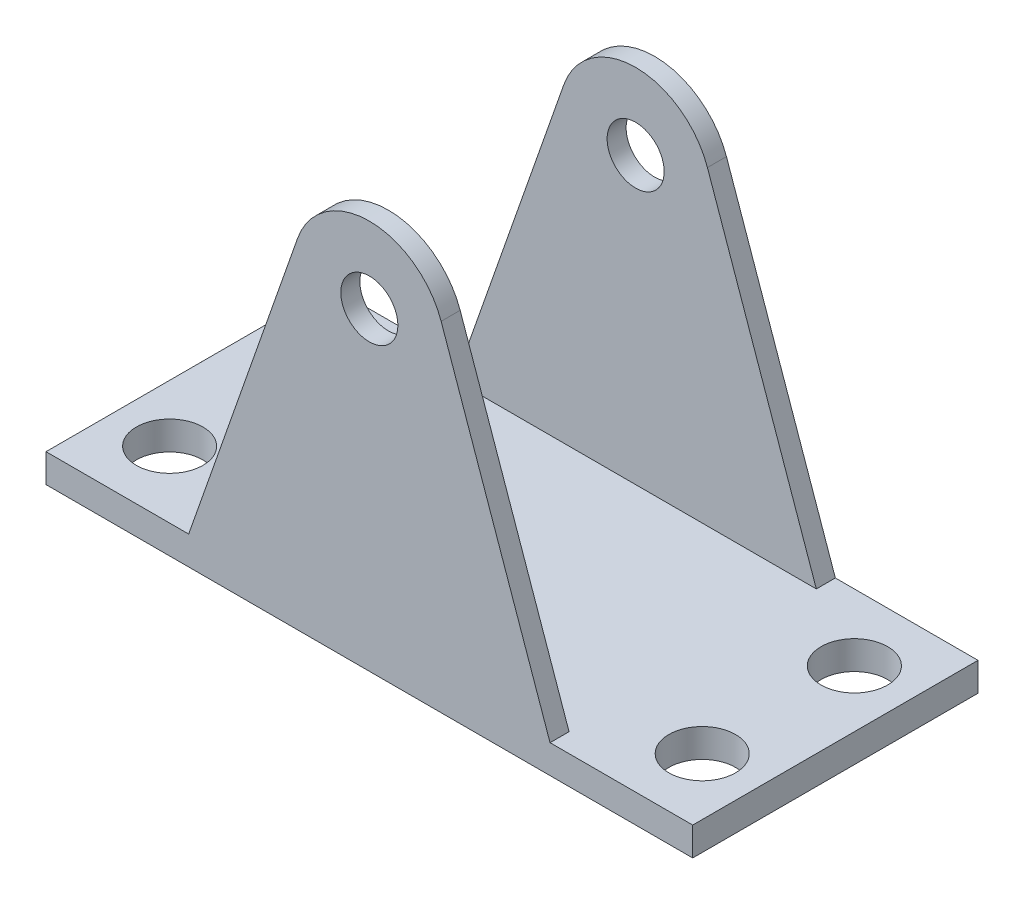
ISO-10303-21;
HEADER;
FILE_DESCRIPTION(('STEP AP214'),'2;1');
FILE_NAME('part.step','',(''),(''),'','','');
FILE_SCHEMA(('AUTOMOTIVE_DESIGN { 1 0 10303 214 1 1 1 1 }'));
ENDSEC;
DATA;
#1=APPLICATION_CONTEXT('core data for automotive mechanical design processes');
#2=APPLICATION_PROTOCOL_DEFINITION('international standard','automotive_design',2000,#1);
#3=PRODUCT_CONTEXT('',#1,'mechanical');
#4=PRODUCT('Part','Part','',(#3));
#5=PRODUCT_RELATED_PRODUCT_CATEGORY('part','',(#4));
#6=PRODUCT_DEFINITION_FORMATION('','',#4);
#7=PRODUCT_DEFINITION_CONTEXT('part definition',#1,'design');
#8=PRODUCT_DEFINITION('design','',#6,#7);
#9=PRODUCT_DEFINITION_SHAPE('','',#8);
#10=(LENGTH_UNIT() NAMED_UNIT(*) SI_UNIT(.MILLI.,.METRE.));
#11=(NAMED_UNIT(*) PLANE_ANGLE_UNIT() SI_UNIT($,.RADIAN.));
#12=(NAMED_UNIT(*) SI_UNIT($,.STERADIAN.) SOLID_ANGLE_UNIT());
#13=UNCERTAINTY_MEASURE_WITH_UNIT(LENGTH_MEASURE(1.E-05),#10,'distance_accuracy_value','');
#14=(GEOMETRIC_REPRESENTATION_CONTEXT(3) GLOBAL_UNCERTAINTY_ASSIGNED_CONTEXT((#13)) GLOBAL_UNIT_ASSIGNED_CONTEXT((#10,
#11,#12)) REPRESENTATION_CONTEXT('',''));
#15=CARTESIAN_POINT('',(0.,0.,0.));
#16=DIRECTION('',(0.,0.,1.));
#17=DIRECTION('',(1.,0.,0.));
#18=AXIS2_PLACEMENT_3D('',#15,#16,#17);
#19=CARTESIAN_POINT('',(0.,3.,0.));
#20=DIRECTION('',(0.,-1.,0.));
#21=DIRECTION('',(0.,0.,-1.));
#22=AXIS2_PLACEMENT_3D('',#19,#20,#21);
#23=PLANE('',#22);
#24=CARTESIAN_POINT('',(6.00000000000001,3.,-23.));
#25=DIRECTION('',(0.,-1.,0.));
#26=DIRECTION('',(0.,0.,-1.));
#27=AXIS2_PLACEMENT_3D('',#24,#25,#26);
#28=CIRCLE('',#27,3.5);
#29=CARTESIAN_POINT('',(6.00000000000001,3.,-26.5));
#30=VERTEX_POINT('',#29);
#31=EDGE_CURVE('E250',#30,#30,#28,.T.);
#32=ORIENTED_EDGE('',*,*,#31,.T.);
#33=EDGE_LOOP('',(#32));
#34=FACE_BOUND('',#33,.T.);
#35=CARTESIAN_POINT('',(62.,3.,-7.));
#36=DIRECTION('',(0.,-1.,0.));
#37=DIRECTION('',(0.,0.,-1.));
#38=AXIS2_PLACEMENT_3D('',#35,#36,#37);
#39=CIRCLE('',#38,3.5);
#40=CARTESIAN_POINT('',(62.,3.,-10.5));
#41=VERTEX_POINT('',#40);
#42=EDGE_CURVE('E255',#41,#41,#39,.T.);
#43=ORIENTED_EDGE('',*,*,#42,.T.);
#44=EDGE_LOOP('',(#43));
#45=FACE_BOUND('',#44,.T.);
#46=CARTESIAN_POINT('',(62.,3.,-23.));
#47=DIRECTION('',(0.,-1.,0.));
#48=DIRECTION('',(0.,0.,-1.));
#49=AXIS2_PLACEMENT_3D('',#46,#47,#48);
#50=CIRCLE('',#49,3.5);
#51=CARTESIAN_POINT('',(62.,3.,-26.5));
#52=VERTEX_POINT('',#51);
#53=EDGE_CURVE('E258',#52,#52,#50,.T.);
#54=ORIENTED_EDGE('',*,*,#53,.T.);
#55=EDGE_LOOP('',(#54));
#56=FACE_BOUND('',#55,.T.);
#57=CARTESIAN_POINT('',(6.,3.,-7.00000000000002));
#58=DIRECTION('',(0.,-1.,0.));
#59=DIRECTION('',(0.,0.,-1.));
#60=AXIS2_PLACEMENT_3D('',#57,#58,#59);
#61=CIRCLE('',#60,3.5);
#62=CARTESIAN_POINT('',(6.,3.,-10.5));
#63=VERTEX_POINT('',#62);
#64=EDGE_CURVE('E261',#63,#63,#61,.T.);
#65=ORIENTED_EDGE('',*,*,#64,.T.);
#66=EDGE_LOOP('',(#65));
#67=FACE_BOUND('',#66,.T.);
#68=DIRECTION('',(0.,0.,-1.));
#69=VECTOR('',#68,1.);
#70=CARTESIAN_POINT('',(15.,3.,-28.));
#71=LINE('',#70,#69);
#72=CARTESIAN_POINT('',(15.,3.,-28.));
#73=VERTEX_POINT('',#72);
#74=CARTESIAN_POINT('',(15.,3.,-30.));
#75=VERTEX_POINT('',#74);
#76=EDGE_CURVE('E155',#73,#75,#71,.T.);
#77=ORIENTED_EDGE('',*,*,#76,.T.);
#78=DIRECTION('',(-1.,0.,0.));
#79=VECTOR('',#78,1.);
#80=CARTESIAN_POINT('',(0.,3.,-30.));
#81=LINE('',#80,#79);
#82=CARTESIAN_POINT('',(0.,3.,-30.));
#83=VERTEX_POINT('',#82);
#84=EDGE_CURVE('E204',#75,#83,#81,.T.);
#85=ORIENTED_EDGE('',*,*,#84,.T.);
#86=DIRECTION('',(0.,0.,1.));
#87=VECTOR('',#86,1.);
#88=CARTESIAN_POINT('',(0.,3.,0.));
#89=LINE('',#88,#87);
#90=CARTESIAN_POINT('',(0.,3.,0.));
#91=VERTEX_POINT('',#90);
#92=EDGE_CURVE('E194',#83,#91,#89,.T.);
#93=ORIENTED_EDGE('',*,*,#92,.T.);
#94=DIRECTION('',(1.,0.,0.));
#95=VECTOR('',#94,1.);
#96=CARTESIAN_POINT('',(0.,3.,0.));
#97=LINE('',#96,#95);
#98=CARTESIAN_POINT('',(15.,3.,0.));
#99=VERTEX_POINT('',#98);
#100=EDGE_CURVE('E199',#91,#99,#97,.T.);
#101=ORIENTED_EDGE('',*,*,#100,.T.);
#102=DIRECTION('',(0.,0.,1.));
#103=VECTOR('',#102,1.);
#104=CARTESIAN_POINT('',(15.,3.,-2.));
#105=LINE('',#104,#103);
#106=CARTESIAN_POINT('',(15.,3.,-2.));
#107=VERTEX_POINT('',#106);
#108=EDGE_CURVE('E185',#107,#99,#105,.T.);
#109=ORIENTED_EDGE('',*,*,#108,.F.);
#110=DIRECTION('',(1.,0.,0.));
#111=VECTOR('',#110,1.);
#112=CARTESIAN_POINT('',(15.,3.,-2.));
#113=LINE('',#112,#111);
#114=CARTESIAN_POINT('',(53.,3.,-2.));
#115=VERTEX_POINT('',#114);
#116=EDGE_CURVE('E164',#107,#115,#113,.T.);
#117=ORIENTED_EDGE('',*,*,#116,.T.);
#118=DIRECTION('',(0.,0.,1.));
#119=VECTOR('',#118,1.);
#120=CARTESIAN_POINT('',(53.,3.,-2.));
#121=LINE('',#120,#119);
#122=CARTESIAN_POINT('',(53.,3.,0.));
#123=VERTEX_POINT('',#122);
#124=EDGE_CURVE('E177',#115,#123,#121,.T.);
#125=ORIENTED_EDGE('',*,*,#124,.T.);
#126=CARTESIAN_POINT('',(68.,3.,0.));
#127=VERTEX_POINT('',#126);
#128=EDGE_CURVE('E197',#123,#127,#97,.T.);
#129=ORIENTED_EDGE('',*,*,#128,.T.);
#130=DIRECTION('',(0.,0.,-1.));
#131=VECTOR('',#130,1.);
#132=CARTESIAN_POINT('',(68.,3.,0.));
#133=LINE('',#132,#131);
#134=CARTESIAN_POINT('',(68.,3.,-30.));
#135=VERTEX_POINT('',#134);
#136=EDGE_CURVE('E202',#127,#135,#133,.T.);
#137=ORIENTED_EDGE('',*,*,#136,.T.);
#138=CARTESIAN_POINT('',(53.,3.,-30.));
#139=VERTEX_POINT('',#138);
#140=EDGE_CURVE('E205',#135,#139,#81,.T.);
#141=ORIENTED_EDGE('',*,*,#140,.T.);
#142=DIRECTION('',(0.,0.,-1.));
#143=VECTOR('',#142,1.);
#144=CARTESIAN_POINT('',(53.,3.,-28.));
#145=LINE('',#144,#143);
#146=CARTESIAN_POINT('',(53.,3.,-28.));
#147=VERTEX_POINT('',#146);
#148=EDGE_CURVE('E54',#147,#139,#145,.T.);
#149=ORIENTED_EDGE('',*,*,#148,.F.);
#150=DIRECTION('',(1.,0.,0.));
#151=VECTOR('',#150,1.);
#152=CARTESIAN_POINT('',(0.,3.,-28.));
#153=LINE('',#152,#151);
#154=EDGE_CURVE('E49',#73,#147,#153,.T.);
#155=ORIENTED_EDGE('',*,*,#154,.F.);
#156=EDGE_LOOP('',(#77,#85,#93,#101,#109,#117,#125,#129,#137,#141,#149,#155));
#157=FACE_BOUND('',#156,.T.);
#158=ADVANCED_FACE('F34',(#34,#45,#56,#67,#157),#23,.F.);
#159=CARTESIAN_POINT('',(0.,3.,0.));
#160=DIRECTION('',(1.,0.,0.));
#161=DIRECTION('',(0.,0.,-1.));
#162=AXIS2_PLACEMENT_3D('',#159,#160,#161);
#163=PLANE('',#162);
#164=DIRECTION('',(0.,0.,1.));
#165=VECTOR('',#164,1.);
#166=CARTESIAN_POINT('',(0.,0.,0.));
#167=LINE('',#166,#165);
#168=CARTESIAN_POINT('',(0.,0.,-30.));
#169=VERTEX_POINT('',#168);
#170=CARTESIAN_POINT('',(0.,0.,0.));
#171=VERTEX_POINT('',#170);
#172=EDGE_CURVE('E187',#169,#171,#167,.T.);
#173=ORIENTED_EDGE('',*,*,#172,.T.);
#174=DIRECTION('',(0.,-1.,0.));
#175=VECTOR('',#174,1.);
#176=CARTESIAN_POINT('',(0.,3.,0.));
#177=LINE('',#176,#175);
#178=EDGE_CURVE('E11',#91,#171,#177,.T.);
#179=ORIENTED_EDGE('',*,*,#178,.F.);
#180=ORIENTED_EDGE('',*,*,#92,.F.);
#181=DIRECTION('',(0.,-1.,0.));
#182=VECTOR('',#181,1.);
#183=CARTESIAN_POINT('',(0.,3.,-30.));
#184=LINE('',#183,#182);
#185=EDGE_CURVE('E207',#83,#169,#184,.T.);
#186=ORIENTED_EDGE('',*,*,#185,.T.);
#187=EDGE_LOOP('',(#173,#179,#180,#186));
#188=FACE_BOUND('',#187,.T.);
#189=ADVANCED_FACE('F36',(#188),#163,.F.);
#190=CARTESIAN_POINT('',(0.,3.,0.));
#191=DIRECTION('',(0.,0.,-1.));
#192=DIRECTION('',(-1.,0.,0.));
#193=AXIS2_PLACEMENT_3D('',#190,#191,#192);
#194=PLANE('',#193);
#195=DIRECTION('',(1.,0.,0.));
#196=VECTOR('',#195,1.);
#197=CARTESIAN_POINT('',(0.,0.,0.));
#198=LINE('',#197,#196);
#199=CARTESIAN_POINT('',(68.,0.,0.));
#200=VERTEX_POINT('',#199);
#201=EDGE_CURVE('E210',#171,#200,#198,.T.);
#202=ORIENTED_EDGE('',*,*,#201,.T.);
#203=DIRECTION('',(0.,-1.,0.));
#204=VECTOR('',#203,1.);
#205=CARTESIAN_POINT('',(68.,3.,0.));
#206=LINE('',#205,#204);
#207=EDGE_CURVE('E42',#127,#200,#206,.T.);
#208=ORIENTED_EDGE('',*,*,#207,.F.);
#209=ORIENTED_EDGE('',*,*,#128,.F.);
#210=DIRECTION('',(-0.330972298093764,0.943640470674363,0.));
#211=VECTOR('',#210,1.);
#212=CARTESIAN_POINT('',(41.5491237653949,35.6477783847501,0.));
#213=LINE('',#212,#211);
#214=CARTESIAN_POINT('',(41.5491237653949,35.6477783847501,0.));
#215=VERTEX_POINT('',#214);
#216=EDGE_CURVE('E161',#123,#215,#213,.T.);
#217=ORIENTED_EDGE('',*,*,#216,.T.);
#218=CARTESIAN_POINT('',(34.,33.,0.));
#219=DIRECTION('',(0.,0.,1.));
#220=DIRECTION('',(-1.,0.,0.));
#221=AXIS2_PLACEMENT_3D('',#218,#219,#220);
#222=CIRCLE('',#221,8.);
#223=CARTESIAN_POINT('',(26.4508762346051,35.6477783847501,0.));
#224=VERTEX_POINT('',#223);
#225=EDGE_CURVE('E180',#215,#224,#222,.T.);
#226=ORIENTED_EDGE('',*,*,#225,.T.);
#227=DIRECTION('',(-0.330972298093763,-0.943640470674363,0.));
#228=VECTOR('',#227,1.);
#229=CARTESIAN_POINT('',(15.,3.,0.));
#230=LINE('',#229,#228);
#231=EDGE_CURVE('E168',#224,#99,#230,.T.);
#232=ORIENTED_EDGE('',*,*,#231,.T.);
#233=ORIENTED_EDGE('',*,*,#100,.F.);
#234=ORIENTED_EDGE('',*,*,#178,.T.);
#235=EDGE_LOOP('',(#202,#208,#209,#217,#226,#232,#233,#234));
#236=FACE_BOUND('',#235,.T.);
#237=CARTESIAN_POINT('',(34.,33.,0.));
#238=DIRECTION('',(0.,0.,1.));
#239=DIRECTION('',(1.,0.,0.));
#240=AXIS2_PLACEMENT_3D('',#237,#238,#239);
#241=CIRCLE('',#240,3.);
#242=CARTESIAN_POINT('',(37.,33.,0.));
#243=VERTEX_POINT('',#242);
#244=EDGE_CURVE('E157',#243,#243,#241,.T.);
#245=ORIENTED_EDGE('',*,*,#244,.F.);
#246=EDGE_LOOP('',(#245));
#247=FACE_BOUND('',#246,.T.);
#248=ADVANCED_FACE('F300',(#236,#247),#194,.F.);
#249=CARTESIAN_POINT('',(68.,3.,0.));
#250=DIRECTION('',(-1.,0.,0.));
#251=DIRECTION('',(0.,0.,1.));
#252=AXIS2_PLACEMENT_3D('',#249,#250,#251);
#253=PLANE('',#252);
#254=DIRECTION('',(0.,0.,-1.));
#255=VECTOR('',#254,1.);
#256=CARTESIAN_POINT('',(68.,0.,0.));
#257=LINE('',#256,#255);
#258=CARTESIAN_POINT('',(68.,0.,-30.));
#259=VERTEX_POINT('',#258);
#260=EDGE_CURVE('E212',#200,#259,#257,.T.);
#261=ORIENTED_EDGE('',*,*,#260,.T.);
#262=DIRECTION('',(0.,-1.,0.));
#263=VECTOR('',#262,1.);
#264=CARTESIAN_POINT('',(68.,3.,-30.));
#265=LINE('',#264,#263);
#266=EDGE_CURVE('E217',#135,#259,#265,.T.);
#267=ORIENTED_EDGE('',*,*,#266,.F.);
#268=ORIENTED_EDGE('',*,*,#136,.F.);
#269=ORIENTED_EDGE('',*,*,#207,.T.);
#270=EDGE_LOOP('',(#261,#267,#268,#269));
#271=FACE_BOUND('',#270,.T.);
#272=ADVANCED_FACE('F224',(#271),#253,.F.);
#273=CARTESIAN_POINT('',(0.,3.,-30.));
#274=DIRECTION('',(0.,0.,1.));
#275=DIRECTION('',(1.,0.,0.));
#276=AXIS2_PLACEMENT_3D('',#273,#274,#275);
#277=PLANE('',#276);
#278=DIRECTION('',(-1.,0.,0.));
#279=VECTOR('',#278,1.);
#280=CARTESIAN_POINT('',(0.,0.,-30.));
#281=LINE('',#280,#279);
#282=EDGE_CURVE('E198',#259,#169,#281,.T.);
#283=ORIENTED_EDGE('',*,*,#282,.T.);
#284=ORIENTED_EDGE('',*,*,#185,.F.);
#285=ORIENTED_EDGE('',*,*,#84,.F.);
#286=DIRECTION('',(-0.330972298093763,-0.943640470674363,0.));
#287=VECTOR('',#286,1.);
#288=CARTESIAN_POINT('',(13.356860068418,-1.68478282730061,-30.));
#289=LINE('',#288,#287);
#290=CARTESIAN_POINT('',(26.4508762346051,35.6477783847501,-30.));
#291=VERTEX_POINT('',#290);
#292=EDGE_CURVE('E146',#291,#75,#289,.T.);
#293=ORIENTED_EDGE('',*,*,#292,.F.);
#294=CARTESIAN_POINT('',(34.,33.,-30.));
#295=DIRECTION('',(0.,0.,1.));
#296=DIRECTION('',(1.,0.,0.));
#297=AXIS2_PLACEMENT_3D('',#294,#295,#296);
#298=CIRCLE('',#297,8.);
#299=CARTESIAN_POINT('',(41.5491237653949,35.6477783847501,-30.));
#300=VERTEX_POINT('',#299);
#301=EDGE_CURVE('E151',#300,#291,#298,.T.);
#302=ORIENTED_EDGE('',*,*,#301,.F.);
#303=DIRECTION('',(-0.330972298093764,0.943640470674363,0.));
#304=VECTOR('',#303,1.);
#305=CARTESIAN_POINT('',(47.1942389084102,19.5528993231289,-30.));
#306=LINE('',#305,#304);
#307=EDGE_CURVE('E134',#139,#300,#306,.T.);
#308=ORIENTED_EDGE('',*,*,#307,.F.);
#309=ORIENTED_EDGE('',*,*,#140,.F.);
#310=ORIENTED_EDGE('',*,*,#266,.T.);
#311=EDGE_LOOP('',(#283,#284,#285,#293,#302,#308,#309,#310));
#312=FACE_BOUND('',#311,.T.);
#313=CARTESIAN_POINT('',(34.,33.,-30.));
#314=DIRECTION('',(0.,0.,1.));
#315=DIRECTION('',(1.,0.,0.));
#316=AXIS2_PLACEMENT_3D('',#313,#314,#315);
#317=CIRCLE('',#316,3.);
#318=CARTESIAN_POINT('',(37.,33.,-30.));
#319=VERTEX_POINT('',#318);
#320=EDGE_CURVE('E247',#319,#319,#317,.T.);
#321=ORIENTED_EDGE('',*,*,#320,.T.);
#322=EDGE_LOOP('',(#321));
#323=FACE_BOUND('',#322,.T.);
#324=ADVANCED_FACE('F234',(#312,#323),#277,.F.);
#325=CARTESIAN_POINT('',(0.,0.,0.));
#326=DIRECTION('',(0.,-1.,0.));
#327=DIRECTION('',(0.,0.,-1.));
#328=AXIS2_PLACEMENT_3D('',#325,#326,#327);
#329=PLANE('',#328);
#330=CARTESIAN_POINT('',(6.00000000000001,0.,-23.));
#331=DIRECTION('',(0.,-1.,0.));
#332=DIRECTION('',(0.,0.,-1.));
#333=AXIS2_PLACEMENT_3D('',#330,#331,#332);
#334=CIRCLE('',#333,3.5);
#335=CARTESIAN_POINT('',(6.00000000000001,0.,-26.5));
#336=VERTEX_POINT('',#335);
#337=EDGE_CURVE('E267',#336,#336,#334,.T.);
#338=ORIENTED_EDGE('',*,*,#337,.F.);
#339=EDGE_LOOP('',(#338));
#340=FACE_BOUND('',#339,.T.);
#341=CARTESIAN_POINT('',(62.,0.,-7.));
#342=DIRECTION('',(0.,-1.,0.));
#343=DIRECTION('',(0.,0.,-1.));
#344=AXIS2_PLACEMENT_3D('',#341,#342,#343);
#345=CIRCLE('',#344,3.5);
#346=CARTESIAN_POINT('',(62.,0.,-10.5));
#347=VERTEX_POINT('',#346);
#348=EDGE_CURVE('E268',#347,#347,#345,.T.);
#349=ORIENTED_EDGE('',*,*,#348,.F.);
#350=EDGE_LOOP('',(#349));
#351=FACE_BOUND('',#350,.T.);
#352=CARTESIAN_POINT('',(62.,0.,-23.));
#353=DIRECTION('',(0.,-1.,0.));
#354=DIRECTION('',(0.,0.,-1.));
#355=AXIS2_PLACEMENT_3D('',#352,#353,#354);
#356=CIRCLE('',#355,3.5);
#357=CARTESIAN_POINT('',(62.,0.,-26.5));
#358=VERTEX_POINT('',#357);
#359=EDGE_CURVE('E271',#358,#358,#356,.T.);
#360=ORIENTED_EDGE('',*,*,#359,.F.);
#361=EDGE_LOOP('',(#360));
#362=FACE_BOUND('',#361,.T.);
#363=CARTESIAN_POINT('',(6.,0.,-7.00000000000002));
#364=DIRECTION('',(0.,-1.,0.));
#365=DIRECTION('',(0.,0.,-1.));
#366=AXIS2_PLACEMENT_3D('',#363,#364,#365);
#367=CIRCLE('',#366,3.5);
#368=CARTESIAN_POINT('',(6.,0.,-10.5));
#369=VERTEX_POINT('',#368);
#370=EDGE_CURVE('E264',#369,#369,#367,.T.);
#371=ORIENTED_EDGE('',*,*,#370,.F.);
#372=EDGE_LOOP('',(#371));
#373=FACE_BOUND('',#372,.T.);
#374=ORIENTED_EDGE('',*,*,#172,.F.);
#375=ORIENTED_EDGE('',*,*,#282,.F.);
#376=ORIENTED_EDGE('',*,*,#260,.F.);
#377=ORIENTED_EDGE('',*,*,#201,.F.);
#378=EDGE_LOOP('',(#374,#375,#376,#377));
#379=FACE_BOUND('',#378,.T.);
#380=ADVANCED_FACE('F231',(#340,#351,#362,#373,#379),#329,.T.);
#381=CARTESIAN_POINT('',(15.,3.,-2.));
#382=DIRECTION('',(-0.943640470674363,0.330972298093763,0.));
#383=DIRECTION('',(-0.330972298093763,-0.943640470674363,0.));
#384=AXIS2_PLACEMENT_3D('',#381,#382,#383);
#385=PLANE('',#384);
#386=ORIENTED_EDGE('',*,*,#231,.F.);
#387=DIRECTION('',(0.,0.,1.));
#388=VECTOR('',#387,1.);
#389=CARTESIAN_POINT('',(26.4508762346051,35.6477783847501,-2.));
#390=LINE('',#389,#388);
#391=CARTESIAN_POINT('',(26.4508762346051,35.6477783847501,-2.));
#392=VERTEX_POINT('',#391);
#393=EDGE_CURVE('E188',#392,#224,#390,.T.);
#394=ORIENTED_EDGE('',*,*,#393,.F.);
#395=DIRECTION('',(-0.330972298093763,-0.943640470674363,0.));
#396=VECTOR('',#395,1.);
#397=CARTESIAN_POINT('',(15.,3.,-2.));
#398=LINE('',#397,#396);
#399=EDGE_CURVE('E174',#392,#107,#398,.T.);
#400=ORIENTED_EDGE('',*,*,#399,.T.);
#401=ORIENTED_EDGE('',*,*,#108,.T.);
#402=EDGE_LOOP('',(#386,#394,#400,#401));
#403=FACE_BOUND('',#402,.T.);
#404=ADVANCED_FACE('F282',(#403),#385,.T.);
#405=CARTESIAN_POINT('',(34.,33.,-2.));
#406=DIRECTION('',(0.,0.,1.));
#407=DIRECTION('',(1.,0.,0.));
#408=AXIS2_PLACEMENT_3D('',#405,#406,#407);
#409=CYLINDRICAL_SURFACE('',#408,8.);
#410=ORIENTED_EDGE('',*,*,#225,.F.);
#411=DIRECTION('',(0.,0.,1.));
#412=VECTOR('',#411,1.);
#413=CARTESIAN_POINT('',(41.5491237653949,35.6477783847501,-2.));
#414=LINE('',#413,#412);
#415=CARTESIAN_POINT('',(41.5491237653949,35.6477783847501,-2.));
#416=VERTEX_POINT('',#415);
#417=EDGE_CURVE('E190',#416,#215,#414,.T.);
#418=ORIENTED_EDGE('',*,*,#417,.F.);
#419=CARTESIAN_POINT('',(34.,33.,-2.));
#420=DIRECTION('',(0.,0.,1.));
#421=DIRECTION('',(-1.,0.,0.));
#422=AXIS2_PLACEMENT_3D('',#419,#420,#421);
#423=CIRCLE('',#422,8.);
#424=EDGE_CURVE('E171',#416,#392,#423,.T.);
#425=ORIENTED_EDGE('',*,*,#424,.T.);
#426=ORIENTED_EDGE('',*,*,#393,.T.);
#427=EDGE_LOOP('',(#410,#418,#425,#426));
#428=FACE_BOUND('',#427,.T.);
#429=ADVANCED_FACE('F332',(#428),#409,.T.);
#430=CARTESIAN_POINT('',(41.5491237653949,35.6477783847501,-2.));
#431=DIRECTION('',(0.943640470674363,0.330972298093764,0.));
#432=DIRECTION('',(-0.330972298093764,0.943640470674363,0.));
#433=AXIS2_PLACEMENT_3D('',#430,#431,#432);
#434=PLANE('',#433);
#435=ORIENTED_EDGE('',*,*,#216,.F.);
#436=ORIENTED_EDGE('',*,*,#124,.F.);
#437=DIRECTION('',(-0.330972298093764,0.943640470674363,0.));
#438=VECTOR('',#437,1.);
#439=CARTESIAN_POINT('',(41.5491237653949,35.6477783847501,-2.));
#440=LINE('',#439,#438);
#441=EDGE_CURVE('E167',#115,#416,#440,.T.);
#442=ORIENTED_EDGE('',*,*,#441,.T.);
#443=ORIENTED_EDGE('',*,*,#417,.T.);
#444=EDGE_LOOP('',(#435,#436,#442,#443));
#445=FACE_BOUND('',#444,.T.);
#446=ADVANCED_FACE('F303',(#445),#434,.T.);
#447=CARTESIAN_POINT('',(34.,33.,-2.));
#448=DIRECTION('',(0.,0.,-1.));
#449=DIRECTION('',(-1.,0.,0.));
#450=AXIS2_PLACEMENT_3D('',#447,#448,#449);
#451=PLANE('',#450);
#452=CARTESIAN_POINT('',(34.,33.,-2.));
#453=DIRECTION('',(0.,0.,1.));
#454=DIRECTION('',(1.,0.,0.));
#455=AXIS2_PLACEMENT_3D('',#452,#453,#454);
#456=CIRCLE('',#455,3.);
#457=CARTESIAN_POINT('',(37.,33.,-2.));
#458=VERTEX_POINT('',#457);
#459=EDGE_CURVE('E158',#458,#458,#456,.T.);
#460=ORIENTED_EDGE('',*,*,#459,.T.);
#461=EDGE_LOOP('',(#460));
#462=FACE_BOUND('',#461,.T.);
#463=ORIENTED_EDGE('',*,*,#116,.F.);
#464=ORIENTED_EDGE('',*,*,#399,.F.);
#465=ORIENTED_EDGE('',*,*,#424,.F.);
#466=ORIENTED_EDGE('',*,*,#441,.F.);
#467=EDGE_LOOP('',(#463,#464,#465,#466));
#468=FACE_BOUND('',#467,.T.);
#469=ADVANCED_FACE('F317',(#462,#468),#451,.T.);
#470=CARTESIAN_POINT('',(34.,33.,-2.));
#471=DIRECTION('',(0.,0.,1.));
#472=DIRECTION('',(1.,0.,0.));
#473=AXIS2_PLACEMENT_3D('',#470,#471,#472);
#474=CYLINDRICAL_SURFACE('',#473,3.);
#475=ORIENTED_EDGE('',*,*,#459,.F.);
#476=EDGE_LOOP('',(#475));
#477=FACE_BOUND('',#476,.T.);
#478=ORIENTED_EDGE('',*,*,#244,.T.);
#479=EDGE_LOOP('',(#478));
#480=FACE_BOUND('',#479,.T.);
#481=ADVANCED_FACE('F315',(#477,#480),#474,.F.);
#482=CARTESIAN_POINT('',(34.,33.,-28.));
#483=DIRECTION('',(0.,0.,1.));
#484=DIRECTION('',(1.,0.,0.));
#485=AXIS2_PLACEMENT_3D('',#482,#483,#484);
#486=PLANE('',#485);
#487=DIRECTION('',(-0.330972298093763,-0.943640470674363,0.));
#488=VECTOR('',#487,1.);
#489=CARTESIAN_POINT('',(13.356860068418,-1.68478282730061,-28.));
#490=LINE('',#489,#488);
#491=CARTESIAN_POINT('',(26.4508762346051,35.6477783847501,-28.));
#492=VERTEX_POINT('',#491);
#493=EDGE_CURVE('E152',#492,#73,#490,.T.);
#494=ORIENTED_EDGE('',*,*,#493,.T.);
#495=ORIENTED_EDGE('',*,*,#154,.T.);
#496=DIRECTION('',(-0.330972298093764,0.943640470674363,0.));
#497=VECTOR('',#496,1.);
#498=CARTESIAN_POINT('',(47.1942389084102,19.5528993231289,-28.));
#499=LINE('',#498,#497);
#500=CARTESIAN_POINT('',(41.5491237653949,35.6477783847501,-28.));
#501=VERTEX_POINT('',#500);
#502=EDGE_CURVE('E121',#147,#501,#499,.T.);
#503=ORIENTED_EDGE('',*,*,#502,.T.);
#504=CARTESIAN_POINT('',(34.,33.,-28.));
#505=DIRECTION('',(0.,0.,1.));
#506=DIRECTION('',(1.,0.,0.));
#507=AXIS2_PLACEMENT_3D('',#504,#505,#506);
#508=CIRCLE('',#507,8.);
#509=EDGE_CURVE('E126',#501,#492,#508,.T.);
#510=ORIENTED_EDGE('',*,*,#509,.T.);
#511=EDGE_LOOP('',(#494,#495,#503,#510));
#512=FACE_BOUND('',#511,.T.);
#513=CARTESIAN_POINT('',(34.,33.,-28.));
#514=DIRECTION('',(0.,0.,1.));
#515=DIRECTION('',(1.,0.,0.));
#516=AXIS2_PLACEMENT_3D('',#513,#514,#515);
#517=CIRCLE('',#516,3.);
#518=CARTESIAN_POINT('',(37.,33.,-28.));
#519=VERTEX_POINT('',#518);
#520=EDGE_CURVE('E149',#519,#519,#517,.T.);
#521=ORIENTED_EDGE('',*,*,#520,.F.);
#522=EDGE_LOOP('',(#521));
#523=FACE_BOUND('',#522,.T.);
#524=ADVANCED_FACE('F123',(#512,#523),#486,.T.);
#525=CARTESIAN_POINT('',(13.356860068418,-1.68478282730061,-28.));
#526=DIRECTION('',(0.943640470674363,-0.330972298093763,0.));
#527=DIRECTION('',(0.330972298093763,0.943640470674363,0.));
#528=AXIS2_PLACEMENT_3D('',#525,#526,#527);
#529=PLANE('',#528);
#530=ORIENTED_EDGE('',*,*,#292,.T.);
#531=ORIENTED_EDGE('',*,*,#76,.F.);
#532=ORIENTED_EDGE('',*,*,#493,.F.);
#533=DIRECTION('',(0.,0.,-1.));
#534=VECTOR('',#533,1.);
#535=CARTESIAN_POINT('',(26.4508762346051,35.6477783847501,-28.));
#536=LINE('',#535,#534);
#537=EDGE_CURVE('E137',#492,#291,#536,.T.);
#538=ORIENTED_EDGE('',*,*,#537,.T.);
#539=EDGE_LOOP('',(#530,#531,#532,#538));
#540=FACE_BOUND('',#539,.T.);
#541=ADVANCED_FACE('F244',(#540),#529,.F.);
#542=CARTESIAN_POINT('',(47.1942389084102,19.5528993231289,-28.));
#543=DIRECTION('',(-0.943640470674363,-0.330972298093764,0.));
#544=DIRECTION('',(0.330972298093764,-0.943640470674363,0.));
#545=AXIS2_PLACEMENT_3D('',#542,#543,#544);
#546=PLANE('',#545);
#547=ORIENTED_EDGE('',*,*,#307,.T.);
#548=DIRECTION('',(0.,0.,-1.));
#549=VECTOR('',#548,1.);
#550=CARTESIAN_POINT('',(41.5491237653949,35.6477783847501,-28.));
#551=LINE('',#550,#549);
#552=EDGE_CURVE('E131',#501,#300,#551,.T.);
#553=ORIENTED_EDGE('',*,*,#552,.F.);
#554=ORIENTED_EDGE('',*,*,#502,.F.);
#555=ORIENTED_EDGE('',*,*,#148,.T.);
#556=EDGE_LOOP('',(#547,#553,#554,#555));
#557=FACE_BOUND('',#556,.T.);
#558=ADVANCED_FACE('F132',(#557),#546,.F.);
#559=CARTESIAN_POINT('',(34.,33.,-28.));
#560=DIRECTION('',(0.,0.,-1.));
#561=DIRECTION('',(-1.,0.,0.));
#562=AXIS2_PLACEMENT_3D('',#559,#560,#561);
#563=CYLINDRICAL_SURFACE('',#562,8.);
#564=ORIENTED_EDGE('',*,*,#301,.T.);
#565=ORIENTED_EDGE('',*,*,#537,.F.);
#566=ORIENTED_EDGE('',*,*,#509,.F.);
#567=ORIENTED_EDGE('',*,*,#552,.T.);
#568=EDGE_LOOP('',(#564,#565,#566,#567));
#569=FACE_BOUND('',#568,.T.);
#570=ADVANCED_FACE('F139',(#569),#563,.T.);
#571=CARTESIAN_POINT('',(34.,33.,-28.));
#572=DIRECTION('',(0.,0.,-1.));
#573=DIRECTION('',(-1.,0.,0.));
#574=AXIS2_PLACEMENT_3D('',#571,#572,#573);
#575=CYLINDRICAL_SURFACE('',#574,3.);
#576=ORIENTED_EDGE('',*,*,#520,.T.);
#577=EDGE_LOOP('',(#576));
#578=FACE_BOUND('',#577,.T.);
#579=ORIENTED_EDGE('',*,*,#320,.F.);
#580=EDGE_LOOP('',(#579));
#581=FACE_BOUND('',#580,.T.);
#582=ADVANCED_FACE('F290',(#578,#581),#575,.F.);
#583=CARTESIAN_POINT('',(6.,12.,-7.00000000000002));
#584=DIRECTION('',(0.,-1.,0.));
#585=DIRECTION('',(0.,0.,-1.));
#586=AXIS2_PLACEMENT_3D('',#583,#584,#585);
#587=CYLINDRICAL_SURFACE('',#586,3.5);
#588=ORIENTED_EDGE('',*,*,#370,.T.);
#589=EDGE_LOOP('',(#588));
#590=FACE_BOUND('',#589,.T.);
#591=ORIENTED_EDGE('',*,*,#64,.F.);
#592=EDGE_LOOP('',(#591));
#593=FACE_BOUND('',#592,.T.);
#594=ADVANCED_FACE('F287',(#590,#593),#587,.F.);
#595=CARTESIAN_POINT('',(62.,12.,-23.));
#596=DIRECTION('',(0.,-1.,0.));
#597=DIRECTION('',(0.,0.,-1.));
#598=AXIS2_PLACEMENT_3D('',#595,#596,#597);
#599=CYLINDRICAL_SURFACE('',#598,3.5);
#600=ORIENTED_EDGE('',*,*,#359,.T.);
#601=EDGE_LOOP('',(#600));
#602=FACE_BOUND('',#601,.T.);
#603=ORIENTED_EDGE('',*,*,#53,.F.);
#604=EDGE_LOOP('',(#603));
#605=FACE_BOUND('',#604,.T.);
#606=ADVANCED_FACE('F277',(#602,#605),#599,.F.);
#607=CARTESIAN_POINT('',(62.,12.,-7.));
#608=DIRECTION('',(0.,-1.,0.));
#609=DIRECTION('',(0.,0.,-1.));
#610=AXIS2_PLACEMENT_3D('',#607,#608,#609);
#611=CYLINDRICAL_SURFACE('',#610,3.5);
#612=ORIENTED_EDGE('',*,*,#348,.T.);
#613=EDGE_LOOP('',(#612));
#614=FACE_BOUND('',#613,.T.);
#615=ORIENTED_EDGE('',*,*,#42,.F.);
#616=EDGE_LOOP('',(#615));
#617=FACE_BOUND('',#616,.T.);
#618=ADVANCED_FACE('F426',(#614,#617),#611,.F.);
#619=CARTESIAN_POINT('',(6.00000000000001,12.,-23.));
#620=DIRECTION('',(0.,-1.,0.));
#621=DIRECTION('',(0.,0.,-1.));
#622=AXIS2_PLACEMENT_3D('',#619,#620,#621);
#623=CYLINDRICAL_SURFACE('',#622,3.5);
#624=ORIENTED_EDGE('',*,*,#337,.T.);
#625=EDGE_LOOP('',(#624));
#626=FACE_BOUND('',#625,.T.);
#627=ORIENTED_EDGE('',*,*,#31,.F.);
#628=EDGE_LOOP('',(#627));
#629=FACE_BOUND('',#628,.T.);
#630=ADVANCED_FACE('F435',(#626,#629),#623,.F.);
#631=CLOSED_SHELL('',(#158,#189,#248,#272,#324,#380,#404,#429,#446,#469,#481,#524,#541,#558,
#570,#582,#594,#606,#618,#630));
#632=MANIFOLD_SOLID_BREP('B2',#631);
#633=ADVANCED_BREP_SHAPE_REPRESENTATION('',(#18,#632),#14);
#634=SHAPE_DEFINITION_REPRESENTATION(#9,#633);
ENDSEC;
END-ISO-10303-21;
